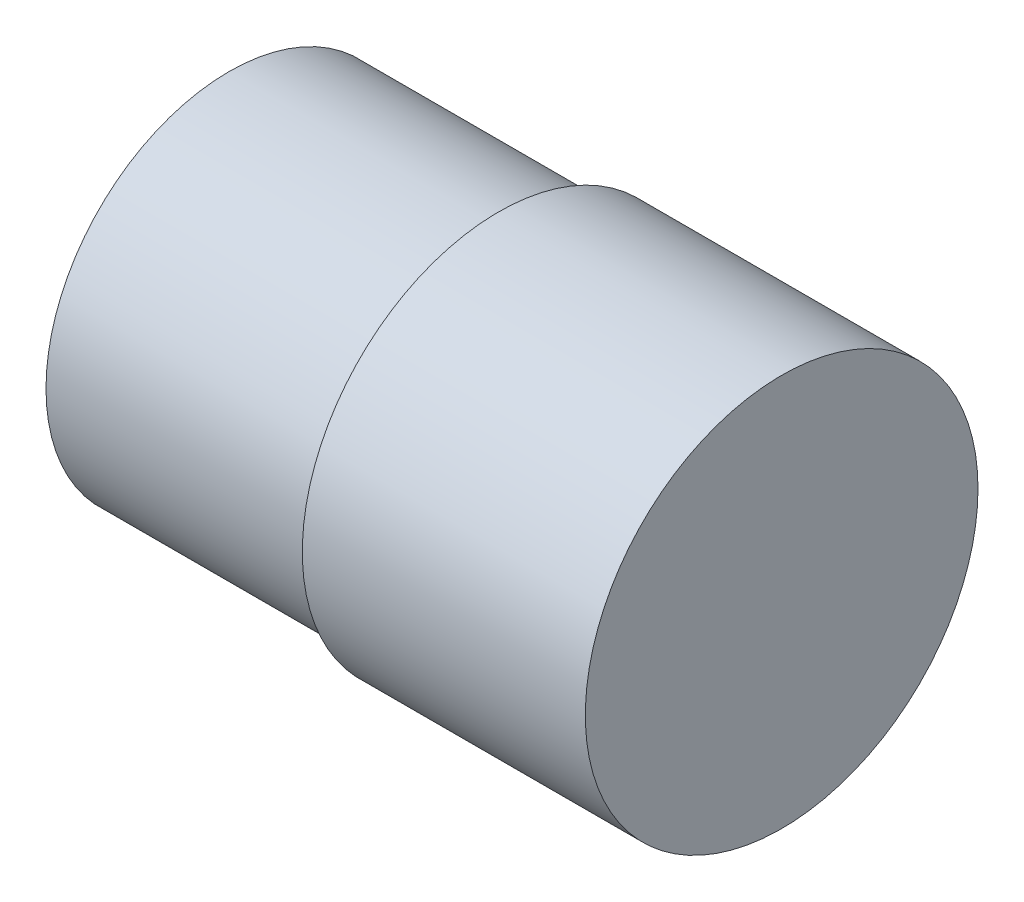
ISO-10303-21;
HEADER;
FILE_DESCRIPTION(('STEP AP214'),'2;1');
FILE_NAME('part.step','',(''),(''),'','','');
FILE_SCHEMA(('AUTOMOTIVE_DESIGN { 1 0 10303 214 1 1 1 1 }'));
ENDSEC;
DATA;
#1=APPLICATION_CONTEXT('core data for automotive mechanical design processes');
#2=APPLICATION_PROTOCOL_DEFINITION('international standard','automotive_design',2000,#1);
#3=PRODUCT_CONTEXT('',#1,'mechanical');
#4=PRODUCT('Part','Part','',(#3));
#5=PRODUCT_RELATED_PRODUCT_CATEGORY('part','',(#4));
#6=PRODUCT_DEFINITION_FORMATION('','',#4);
#7=PRODUCT_DEFINITION_CONTEXT('part definition',#1,'design');
#8=PRODUCT_DEFINITION('design','',#6,#7);
#9=PRODUCT_DEFINITION_SHAPE('','',#8);
#10=(LENGTH_UNIT() NAMED_UNIT(*) SI_UNIT(.MILLI.,.METRE.));
#11=(NAMED_UNIT(*) PLANE_ANGLE_UNIT() SI_UNIT($,.RADIAN.));
#12=(NAMED_UNIT(*) SI_UNIT($,.STERADIAN.) SOLID_ANGLE_UNIT());
#13=UNCERTAINTY_MEASURE_WITH_UNIT(LENGTH_MEASURE(1.E-05),#10,'distance_accuracy_value','');
#14=(GEOMETRIC_REPRESENTATION_CONTEXT(3) GLOBAL_UNCERTAINTY_ASSIGNED_CONTEXT((#13)) GLOBAL_UNIT_ASSIGNED_CONTEXT((#10,
#11,#12)) REPRESENTATION_CONTEXT('',''));
#15=CARTESIAN_POINT('',(0.,0.,0.));
#16=DIRECTION('',(0.,0.,1.));
#17=DIRECTION('',(1.,0.,0.));
#18=AXIS2_PLACEMENT_3D('',#15,#16,#17);
#19=CARTESIAN_POINT('',(26.67,0.,0.));
#20=DIRECTION('',(-1.,0.,0.));
#21=DIRECTION('',(0.,0.,1.));
#22=AXIS2_PLACEMENT_3D('',#19,#20,#21);
#23=CYLINDRICAL_SURFACE('',#22,18.499999957);
#24=CARTESIAN_POINT('',(26.67,0.,0.));
#25=DIRECTION('',(1.,0.,0.));
#26=DIRECTION('',(0.,0.,-1.));
#27=AXIS2_PLACEMENT_3D('',#24,#25,#26);
#28=CIRCLE('',#27,18.499999957);
#29=CARTESIAN_POINT('',(26.67,0.,-18.499999957));
#30=VERTEX_POINT('',#29);
#31=EDGE_CURVE('E51',#30,#30,#28,.T.);
#32=ORIENTED_EDGE('',*,*,#31,.F.);
#33=EDGE_LOOP('',(#32));
#34=FACE_BOUND('',#33,.T.);
#35=CARTESIAN_POINT('',(0.,0.,0.));
#36=DIRECTION('',(1.,0.,0.));
#37=DIRECTION('',(0.,0.,-1.));
#38=AXIS2_PLACEMENT_3D('',#35,#36,#37);
#39=CIRCLE('',#38,18.499999957);
#40=CARTESIAN_POINT('',(0.,0.,-18.499999957));
#41=VERTEX_POINT('',#40);
#42=EDGE_CURVE('E46',#41,#41,#39,.T.);
#43=ORIENTED_EDGE('',*,*,#42,.T.);
#44=EDGE_LOOP('',(#43));
#45=FACE_BOUND('',#44,.T.);
#46=ADVANCED_FACE('F43',(#34,#45),#23,.T.);
#47=CARTESIAN_POINT('',(26.67,0.,0.));
#48=DIRECTION('',(1.,0.,0.));
#49=DIRECTION('',(0.,0.,-1.));
#50=AXIS2_PLACEMENT_3D('',#47,#48,#49);
#51=PLANE('',#50);
#52=ORIENTED_EDGE('',*,*,#31,.T.);
#53=EDGE_LOOP('',(#52));
#54=FACE_BOUND('',#53,.T.);
#55=ADVANCED_FACE('F71',(#54),#51,.T.);
#56=CARTESIAN_POINT('',(0.,0.,0.));
#57=DIRECTION('',(1.,0.,0.));
#58=DIRECTION('',(0.,0.,-1.));
#59=AXIS2_PLACEMENT_3D('',#56,#57,#58);
#60=PLANE('',#59);
#61=CARTESIAN_POINT('',(0.,0.,0.));
#62=DIRECTION('',(-1.,0.,0.));
#63=DIRECTION('',(0.,0.,1.));
#64=AXIS2_PLACEMENT_3D('',#61,#62,#63);
#65=CIRCLE('',#64,17.25);
#66=CARTESIAN_POINT('',(0.,0.,17.25));
#67=VERTEX_POINT('',#66);
#68=EDGE_CURVE('E10',#67,#67,#65,.T.);
#69=ORIENTED_EDGE('',*,*,#68,.F.);
#70=EDGE_LOOP('',(#69));
#71=FACE_BOUND('',#70,.T.);
#72=ORIENTED_EDGE('',*,*,#42,.F.);
#73=EDGE_LOOP('',(#72));
#74=FACE_BOUND('',#73,.T.);
#75=ADVANCED_FACE('F68',(#71,#74),#60,.F.);
#76=CARTESIAN_POINT('',(-25.4,0.,0.));
#77=DIRECTION('',(1.,0.,0.));
#78=DIRECTION('',(0.,0.,-1.));
#79=AXIS2_PLACEMENT_3D('',#76,#77,#78);
#80=CYLINDRICAL_SURFACE('',#79,17.25);
#81=CARTESIAN_POINT('',(-25.4,0.,0.));
#82=DIRECTION('',(-1.,0.,0.));
#83=DIRECTION('',(0.,0.,1.));
#84=AXIS2_PLACEMENT_3D('',#81,#82,#83);
#85=CIRCLE('',#84,17.25);
#86=CARTESIAN_POINT('',(-25.4,0.,17.25));
#87=VERTEX_POINT('',#86);
#88=EDGE_CURVE('E58',#87,#87,#85,.T.);
#89=ORIENTED_EDGE('',*,*,#88,.F.);
#90=EDGE_LOOP('',(#89));
#91=FACE_BOUND('',#90,.T.);
#92=ORIENTED_EDGE('',*,*,#68,.T.);
#93=EDGE_LOOP('',(#92));
#94=FACE_BOUND('',#93,.T.);
#95=ADVANCED_FACE('F70',(#91,#94),#80,.T.);
#96=CARTESIAN_POINT('',(-25.4,0.,0.));
#97=DIRECTION('',(-1.,0.,0.));
#98=DIRECTION('',(0.,0.,1.));
#99=AXIS2_PLACEMENT_3D('',#96,#97,#98);
#100=PLANE('',#99);
#101=ORIENTED_EDGE('',*,*,#88,.T.);
#102=EDGE_LOOP('',(#101));
#103=FACE_BOUND('',#102,.T.);
#104=ADVANCED_FACE('F77',(#103),#100,.T.);
#105=CLOSED_SHELL('',(#46,#55,#75,#95,#104));
#106=MANIFOLD_SOLID_BREP('B2',#105);
#107=ADVANCED_BREP_SHAPE_REPRESENTATION('',(#18,#106),#14);
#108=SHAPE_DEFINITION_REPRESENTATION(#9,#107);
ENDSEC;
END-ISO-10303-21;
